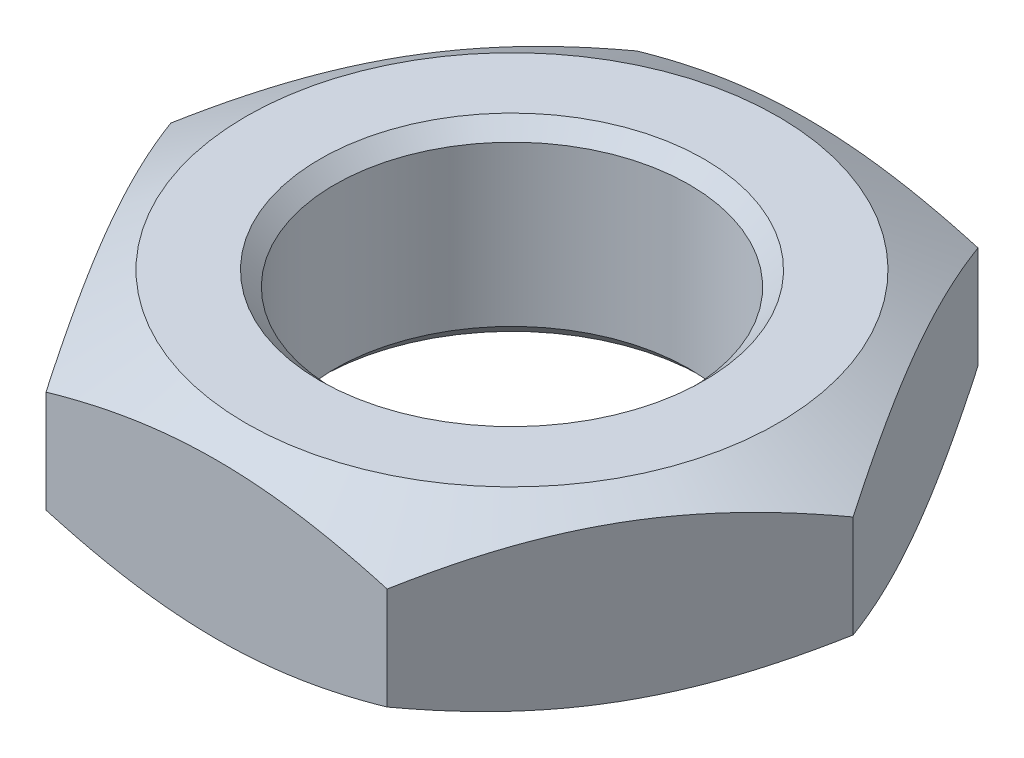
ISO-10303-21;
HEADER;
FILE_DESCRIPTION(('STEP AP214'),'2;1');
FILE_NAME('part.step','',(''),(''),'','','');
FILE_SCHEMA(('AUTOMOTIVE_DESIGN { 1 0 10303 214 1 1 1 1 }'));
ENDSEC;
DATA;
#1=APPLICATION_CONTEXT('core data for automotive mechanical design processes');
#2=APPLICATION_PROTOCOL_DEFINITION('international standard','automotive_design',2000,#1);
#3=PRODUCT_CONTEXT('',#1,'mechanical');
#4=PRODUCT('Part','Part','',(#3));
#5=PRODUCT_RELATED_PRODUCT_CATEGORY('part','',(#4));
#6=PRODUCT_DEFINITION_FORMATION('','',#4);
#7=PRODUCT_DEFINITION_CONTEXT('part definition',#1,'design');
#8=PRODUCT_DEFINITION('design','',#6,#7);
#9=PRODUCT_DEFINITION_SHAPE('','',#8);
#10=(LENGTH_UNIT() NAMED_UNIT(*) SI_UNIT(.MILLI.,.METRE.));
#11=(NAMED_UNIT(*) PLANE_ANGLE_UNIT() SI_UNIT($,.RADIAN.));
#12=(NAMED_UNIT(*) SI_UNIT($,.STERADIAN.) SOLID_ANGLE_UNIT());
#13=UNCERTAINTY_MEASURE_WITH_UNIT(LENGTH_MEASURE(1.E-05),#10,'distance_accuracy_value','');
#14=(GEOMETRIC_REPRESENTATION_CONTEXT(3) GLOBAL_UNCERTAINTY_ASSIGNED_CONTEXT((#13)) GLOBAL_UNIT_ASSIGNED_CONTEXT((#10,
#11,#12)) REPRESENTATION_CONTEXT('',''));
#15=CARTESIAN_POINT('',(0.,0.,0.));
#16=DIRECTION('',(0.,0.,1.));
#17=DIRECTION('',(1.,0.,0.));
#18=AXIS2_PLACEMENT_3D('',#15,#16,#17);
#19=CARTESIAN_POINT('',(-5.77350269189625,3.2,0.));
#20=DIRECTION('',(0.86602540378444,0.,0.499999999999998));
#21=DIRECTION('',(0.499999999999998,0.,-0.86602540378444));
#22=AXIS2_PLACEMENT_3D('',#19,#20,#21);
#23=PLANE('',#22);
#24=DIRECTION('',(0.,-1.,0.));
#25=VECTOR('',#24,1.);
#26=CARTESIAN_POINT('',(-2.88675134594813,3.2,-5.00000000000002));
#27=LINE('',#26,#25);
#28=CARTESIAN_POINT('',(-2.88675134594813,2.46474287801998,-5.00000000000002));
#29=VERTEX_POINT('',#28);
#30=CARTESIAN_POINT('',(-2.88675134594813,0.735257121980016,-5.00000000000002));
#31=VERTEX_POINT('',#30);
#32=EDGE_CURVE('E101',#29,#31,#27,.T.);
#33=ORIENTED_EDGE('',*,*,#32,.T.);
#34=CARTESIAN_POINT('',(-2.88663587589429,0.735323790646643,-5.00020000000002));
#35=CARTESIAN_POINT('',(-3.01349970319368,0.662061702232448,-4.78046540547483));
#36=CARTESIAN_POINT('',(-3.14144859993849,0.595426456512905,-4.55885141554043));
#37=CARTESIAN_POINT('',(-3.39956193532121,0.479114125605623,-4.1117860045465));
#38=CARTESIAN_POINT('',(-3.52973095989718,0.429478184510602,-3.88632664040924));
#39=CARTESIAN_POINT('',(-3.78847564779797,0.35222616001351,-3.4381676947765));
#40=CARTESIAN_POINT('',(-3.91701101576051,0.324095512878301,-3.21553790689582));
#41=CARTESIAN_POINT('',(-4.11026620624322,0.298870056548495,-2.88081009815337));
#42=CARTESIAN_POINT('',(-4.1747286887931,0.293288594364295,-2.76915780319495));
#43=CARTESIAN_POINT('',(-4.30371322717527,0.28787735134628,-2.54575002932621));
#44=CARTESIAN_POINT('',(-4.36823528110588,0.288047392853013,-2.43399455370969));
#45=CARTESIAN_POINT('',(-4.54500768479194,0.296428766386846,-2.12781576914937));
#46=CARTESIAN_POINT('',(-4.65719946015292,0.31050490649206,-1.93349391403279));
#47=CARTESIAN_POINT('',(-4.88083840557981,0.355140391704237,-1.5461398980023));
#48=CARTESIAN_POINT('',(-4.9922847895602,0.385714994742314,-1.35310909862843));
#49=CARTESIAN_POINT('',(-5.21637431361294,0.462143628215968,-0.964974657525149));
#50=CARTESIAN_POINT('',(-5.32898917185758,0.508321513473484,-0.769920001358267));
#51=CARTESIAN_POINT('',(-5.55253939626497,0.613126929086736,-0.382719654641233));
#52=CARTESIAN_POINT('',(-5.66347762579591,0.671729838032176,-0.190569004591914));
#53=CARTESIAN_POINT('',(-5.77361816195009,0.735323790646629,0.000199999999999733));
#54=B_SPLINE_CURVE_WITH_KNOTS('',3,(#34,#35,#36,#37,#38,#39,#40,#41,#42,#43,#44,#45,#46,#47,#48,
#49,#50,#51,#52,#53),.UNSPECIFIED.,.F.,.F.,(4,2,2,2,2,2,2,2,2,4),(0.,0.792555841363092,
1.58701660053334,2.36181537487281,2.74884076077326,3.13585419177295,3.8096236259968,
4.4840172390119,5.17336882348929,5.86136694793726),.UNSPECIFIED.);
#55=CARTESIAN_POINT('',(-5.77350269189625,0.735257121980003,0.));
#56=VERTEX_POINT('',#55);
#57=EDGE_CURVE('E44',#31,#56,#54,.T.);
#58=ORIENTED_EDGE('',*,*,#57,.T.);
#59=DIRECTION('',(0.,-1.,0.));
#60=VECTOR('',#59,1.);
#61=CARTESIAN_POINT('',(-5.77350269189625,3.2,0.));
#62=LINE('',#61,#60);
#63=CARTESIAN_POINT('',(-5.77350269189625,2.46474287802,0.));
#64=VERTEX_POINT('',#63);
#65=EDGE_CURVE('E114',#64,#56,#62,.T.);
#66=ORIENTED_EDGE('',*,*,#65,.F.);
#67=CARTESIAN_POINT('',(-2.88663587589429,2.46467620935336,-5.00020000000002));
#68=CARTESIAN_POINT('',(-3.01349970319368,2.53793829776755,-4.78046540547483));
#69=CARTESIAN_POINT('',(-3.14144859993849,2.6045735434871,-4.55885141554043));
#70=CARTESIAN_POINT('',(-3.39956193532121,2.72088587439438,-4.1117860045465));
#71=CARTESIAN_POINT('',(-3.52973095989718,2.7705218154894,-3.88632664040924));
#72=CARTESIAN_POINT('',(-3.78847564779797,2.84777383998649,-3.4381676947765));
#73=CARTESIAN_POINT('',(-3.91701101576051,2.8759044871217,-3.21553790689582));
#74=CARTESIAN_POINT('',(-4.11026620624322,2.90112994345151,-2.88081009815337));
#75=CARTESIAN_POINT('',(-4.1747286887931,2.90671140563571,-2.76915780319495));
#76=CARTESIAN_POINT('',(-4.30371322717527,2.91212264865372,-2.54575002932621));
#77=CARTESIAN_POINT('',(-4.36823528110588,2.91195260714699,-2.43399455370969));
#78=CARTESIAN_POINT('',(-4.54500768479194,2.90357123361316,-2.12781576914937));
#79=CARTESIAN_POINT('',(-4.65719946015292,2.88949509350794,-1.93349391403279));
#80=CARTESIAN_POINT('',(-4.88083840557981,2.84485960829576,-1.5461398980023));
#81=CARTESIAN_POINT('',(-4.9922847895602,2.81428500525769,-1.35310909862843));
#82=CARTESIAN_POINT('',(-5.21637431361294,2.73785637178403,-0.964974657525149));
#83=CARTESIAN_POINT('',(-5.32898917185758,2.69167848652652,-0.769920001358267));
#84=CARTESIAN_POINT('',(-5.55253939626497,2.58687307091326,-0.382719654641233));
#85=CARTESIAN_POINT('',(-5.66347762579591,2.52827016196783,-0.190569004591914));
#86=CARTESIAN_POINT('',(-5.77361816195009,2.46467620935337,0.00019999999999973));
#87=B_SPLINE_CURVE_WITH_KNOTS('',3,(#67,#68,#69,#70,#71,#72,#73,#74,#75,#76,#77,#78,#79,#80,#81,
#82,#83,#84,#85,#86),.UNSPECIFIED.,.F.,.F.,(4,2,2,2,2,2,2,2,2,4),(0.,0.792555841363092,
1.58701660053334,2.36181537487281,2.74884076077326,3.13585419177295,3.8096236259968,
4.4840172390119,5.17336882348929,5.86136694793726),.UNSPECIFIED.);
#88=EDGE_CURVE('E105',#29,#64,#87,.T.);
#89=ORIENTED_EDGE('',*,*,#88,.F.);
#90=EDGE_LOOP('',(#33,#58,#66,#89));
#91=FACE_BOUND('',#90,.T.);
#92=ADVANCED_FACE('F29',(#91),#23,.F.);
#93=CARTESIAN_POINT('',(-2.88675134594815,3.2,4.99999999999997));
#94=DIRECTION('',(0.86602540378444,0.,-0.499999999999998));
#95=DIRECTION('',(-0.499999999999998,0.,-0.86602540378444));
#96=AXIS2_PLACEMENT_3D('',#93,#94,#95);
#97=PLANE('',#96);
#98=ORIENTED_EDGE('',*,*,#65,.T.);
#99=CARTESIAN_POINT('',(-5.77361816195009,0.735323790646629,-0.000200000000000029));
#100=CARTESIAN_POINT('',(-5.6467543346507,0.662061702232436,0.219534594525185));
#101=CARTESIAN_POINT('',(-5.51880543790589,0.595426456512894,0.44114858445958));
#102=CARTESIAN_POINT('',(-5.26069210252317,0.479114125605615,0.888213995453513));
#103=CARTESIAN_POINT('',(-5.1305230779472,0.429478184510594,1.11367335959077));
#104=CARTESIAN_POINT('',(-4.87177839004641,0.352226160013505,1.56183230522351));
#105=CARTESIAN_POINT('',(-4.74324302208387,0.324095512878297,1.78446209310419));
#106=CARTESIAN_POINT('',(-4.54998783160116,0.298870056548493,2.11918990184664));
#107=CARTESIAN_POINT('',(-4.48552534905128,0.293288594364292,2.23084219680506));
#108=CARTESIAN_POINT('',(-4.35654081066911,0.287877351346279,2.4542499706738));
#109=CARTESIAN_POINT('',(-4.2920187567385,0.288047392853013,2.56600544629031));
#110=CARTESIAN_POINT('',(-4.11524635305245,0.296428766386846,2.87218423085063));
#111=CARTESIAN_POINT('',(-4.00305457769147,0.310504906492061,3.06650608596721));
#112=CARTESIAN_POINT('',(-3.77941563226458,0.355140391704239,3.45386010199769));
#113=CARTESIAN_POINT('',(-3.6679692482842,0.385714994742315,3.64689090137156));
#114=CARTESIAN_POINT('',(-3.44387972423145,0.462143628215968,4.03502534247483));
#115=CARTESIAN_POINT('',(-3.33126486598682,0.508321513473483,4.23007999864171));
#116=CARTESIAN_POINT('',(-3.10771464157943,0.613126929086734,4.61728034535874));
#117=CARTESIAN_POINT('',(-2.99677641204849,0.671729838032172,4.80943099540805));
#118=CARTESIAN_POINT('',(-2.88663587589432,0.735323790646624,5.00019999999996));
#119=B_SPLINE_CURVE_WITH_KNOTS('',3,(#99,#100,#101,#102,#103,#104,#105,#106,#107,#108,#109,#110,
#111,#112,#113,#114,#115,#116,#117,#118),.UNSPECIFIED.,.F.,.F.,(4,2,2,2,2,2,2,2,2,4),(0.,
0.792555841363088,1.58701660053333,2.3618153748728,2.74884076077325,3.13585419177294,
3.80962362599677,4.48401723901186,5.17336882348925,5.8613669479372),.UNSPECIFIED.);
#120=CARTESIAN_POINT('',(-2.88675134594815,0.735257121979998,4.99999999999997));
#121=VERTEX_POINT('',#120);
#122=EDGE_CURVE('E218',#56,#121,#119,.T.);
#123=ORIENTED_EDGE('',*,*,#122,.T.);
#124=DIRECTION('',(0.,-1.,0.));
#125=VECTOR('',#124,1.);
#126=CARTESIAN_POINT('',(-2.88675134594815,3.2,4.99999999999997));
#127=LINE('',#126,#125);
#128=CARTESIAN_POINT('',(-2.88675134594815,2.46474287802,4.99999999999997));
#129=VERTEX_POINT('',#128);
#130=EDGE_CURVE('E111',#129,#121,#127,.T.);
#131=ORIENTED_EDGE('',*,*,#130,.F.);
#132=CARTESIAN_POINT('',(-5.77361816195009,2.46467620935337,-0.0002));
#133=CARTESIAN_POINT('',(-5.6467543346507,2.53793829776756,0.219534594525184));
#134=CARTESIAN_POINT('',(-5.51880543790589,2.60457354348711,0.44114858445958));
#135=CARTESIAN_POINT('',(-5.26069210252317,2.72088587439439,0.888213995453513));
#136=CARTESIAN_POINT('',(-5.1305230779472,2.77052181548941,1.11367335959077));
#137=CARTESIAN_POINT('',(-4.87177839004641,2.8477738399865,1.56183230522351));
#138=CARTESIAN_POINT('',(-4.74324302208387,2.8759044871217,1.78446209310419));
#139=CARTESIAN_POINT('',(-4.54998783160116,2.90112994345151,2.11918990184664));
#140=CARTESIAN_POINT('',(-4.48552534905128,2.90671140563571,2.23084219680506));
#141=CARTESIAN_POINT('',(-4.35654081066911,2.91212264865372,2.4542499706738));
#142=CARTESIAN_POINT('',(-4.2920187567385,2.91195260714699,2.56600544629031));
#143=CARTESIAN_POINT('',(-4.11524635305245,2.90357123361315,2.87218423085063));
#144=CARTESIAN_POINT('',(-4.00305457769147,2.88949509350794,3.06650608596721));
#145=CARTESIAN_POINT('',(-3.77941563226458,2.84485960829576,3.45386010199769));
#146=CARTESIAN_POINT('',(-3.6679692482842,2.81428500525769,3.64689090137156));
#147=CARTESIAN_POINT('',(-3.44387972423145,2.73785637178403,4.03502534247483));
#148=CARTESIAN_POINT('',(-3.33126486598682,2.69167848652652,4.23007999864171));
#149=CARTESIAN_POINT('',(-3.10771464157943,2.58687307091327,4.61728034535874));
#150=CARTESIAN_POINT('',(-2.99677641204849,2.52827016196783,4.80943099540805));
#151=CARTESIAN_POINT('',(-2.88663587589432,2.46467620935338,5.00019999999996));
#152=B_SPLINE_CURVE_WITH_KNOTS('',3,(#132,#133,#134,#135,#136,#137,#138,#139,#140,#141,#142,
#143,#144,#145,#146,#147,#148,#149,#150,#151),.UNSPECIFIED.,.F.,.F.,(4,2,2,2,2,2,2,2,2,4),(0.,
0.792555841363088,1.58701660053333,2.3618153748728,2.74884076077325,3.13585419177294,
3.80962362599677,4.48401723901186,5.17336882348925,5.8613669479372),.UNSPECIFIED.);
#153=EDGE_CURVE('E160',#64,#129,#152,.T.);
#154=ORIENTED_EDGE('',*,*,#153,.F.);
#155=EDGE_LOOP('',(#98,#123,#131,#154));
#156=FACE_BOUND('',#155,.T.);
#157=ADVANCED_FACE('F150',(#156),#97,.F.);
#158=CARTESIAN_POINT('',(2.88675134594816,3.2,4.99999999999997));
#159=DIRECTION('',(0.,0.,-1.));
#160=DIRECTION('',(-1.,0.,0.));
#161=AXIS2_PLACEMENT_3D('',#158,#159,#160);
#162=PLANE('',#161);
#163=ORIENTED_EDGE('',*,*,#130,.T.);
#164=CARTESIAN_POINT('',(-7.67424266617577,2.69008668639454,4.99999999999997));
#165=CARTESIAN_POINT('',(-7.45650712496601,2.58478938651722,4.99999999999997));
#166=CARTESIAN_POINT('',(-7.23826305239856,2.48052517639314,4.99999999999997));
#167=CARTESIAN_POINT('',(-6.80048707372623,2.27464567989357,4.99999999999997));
#168=CARTESIAN_POINT('',(-6.58095496369159,2.17303082764698,4.99999999999997));
#169=CARTESIAN_POINT('',(-6.13916226954692,1.97250436282504,4.99999999999997));
#170=CARTESIAN_POINT('',(-5.91689328206098,1.87361119869213,4.99999999999997));
#171=CARTESIAN_POINT('',(-5.47055908649732,1.67998059287781,4.99999999999997));
#172=CARTESIAN_POINT('',(-5.24649396637654,1.58524294915253,4.99999999999997));
#173=CARTESIAN_POINT('',(-4.7893152686145,1.39820205975359,4.99999999999997));
#174=CARTESIAN_POINT('',(-4.55613457527415,1.30606194720281,4.99999999999997));
#175=CARTESIAN_POINT('',(-4.08701577659728,1.12895085351053,4.99999999999997));
#176=CARTESIAN_POINT('',(-3.85107736105748,1.04398068789288,4.99999999999997));
#177=CARTESIAN_POINT('',(-3.37653585976051,0.883498750965564,4.99999999999997));
#178=CARTESIAN_POINT('',(-3.13793955866337,0.807967123459956,4.99999999999997));
#179=CARTESIAN_POINT('',(-2.65732610585403,0.668838421114892,4.99999999999997));
#180=CARTESIAN_POINT('',(-2.4153100832112,0.605237501814807,4.99999999999997));
#181=CARTESIAN_POINT('',(-1.92903620795064,0.493405348623645,4.99999999999997));
#182=CARTESIAN_POINT('',(-1.68479700789419,0.445094525638156,4.99999999999997));
#183=CARTESIAN_POINT('',(-1.19336727900909,0.366632034538383,4.99999999999997));
#184=CARTESIAN_POINT('',(-0.946177008341047,0.336478789693633,4.99999999999997));
#185=CARTESIAN_POINT('',(-0.453274670503006,0.297133032670733,4.99999999999997));
#186=CARTESIAN_POINT('',(-0.20758414007709,0.287677337941843,4.99999999999997));
#187=CARTESIAN_POINT('',(0.283721907876852,0.289840272684433,4.99999999999997));
#188=CARTESIAN_POINT('',(0.529337422979503,0.30145952354635,4.99999999999997));
#189=CARTESIAN_POINT('',(0.948718465808786,0.3384819821124,4.99999999999997));
#190=CARTESIAN_POINT('',(1.12294036223796,0.358991867272684,4.99999999999997));
#191=CARTESIAN_POINT('',(1.47004823746262,0.40929449008512,4.99999999999997));
#192=CARTESIAN_POINT('',(1.64293402116819,0.439088558052839,4.99999999999997));
#193=CARTESIAN_POINT('',(2.15939010253456,0.540824520596738,4.99999999999997));
#194=CARTESIAN_POINT('',(2.50055467476973,0.625099791009425,4.99999999999997));
#195=CARTESIAN_POINT('',(3.01061797223764,0.770470270516962,4.99999999999997));
#196=CARTESIAN_POINT('',(3.18217888624518,0.822749938714918,4.99999999999997));
#197=CARTESIAN_POINT('',(3.52363280333808,0.932546178651754,4.99999999999997));
#198=CARTESIAN_POINT('',(3.69352579556189,0.990062784468678,4.99999999999997));
#199=CARTESIAN_POINT('',(4.03170180497546,1.10942599059165,4.99999999999997));
#200=CARTESIAN_POINT('',(4.19998537363545,1.17127104256856,4.99999999999997));
#201=CARTESIAN_POINT('',(4.53517101606396,1.29858282117489,4.99999999999997));
#202=CARTESIAN_POINT('',(4.70207310450403,1.36404950928505,4.99999999999997));
#203=CARTESIAN_POINT('',(5.08980602948461,1.52021305593794,4.99999999999997));
#204=CARTESIAN_POINT('',(5.31016583407146,1.61207713832132,4.99999999999997));
#205=CARTESIAN_POINT('',(5.74907731355416,1.80003892533716,4.99999999999997));
#206=CARTESIAN_POINT('',(5.96762889034246,1.89613685791614,4.99999999999997));
#207=CARTESIAN_POINT('',(6.40325065578351,2.09173054768495,4.99999999999997));
#208=CARTESIAN_POINT('',(6.62032056522339,2.19122692518072,4.99999999999997));
#209=CARTESIAN_POINT('',(7.05318748262057,2.39295504203552,4.99999999999997));
#210=CARTESIAN_POINT('',(7.26898446544068,2.49518683519305,4.99999999999997));
#211=CARTESIAN_POINT('',(7.91517585706596,2.80539138785612,4.99999999999997));
#212=CARTESIAN_POINT('',(8.34397184898757,3.0166918454417,4.99999999999997));
#213=CARTESIAN_POINT('',(9.19853243826548,3.44533535925732,4.99999999999997));
#214=CARTESIAN_POINT('',(9.62429693074941,3.66267862327008,4.99999999999997));
#215=CARTESIAN_POINT('',(10.2440049625286,3.98301188380493,4.99999999999997));
#216=CARTESIAN_POINT('',(10.4388319162336,4.08429775545548,4.99999999999997));
#217=CARTESIAN_POINT('',(10.8280674822379,4.28766207109142,4.99999999999997));
#218=CARTESIAN_POINT('',(11.0224761017187,4.3897405013304,4.99999999999997));
#219=CARTESIAN_POINT('',(11.6051739882778,4.69701353472328,4.99999999999997));
#220=CARTESIAN_POINT('',(11.9929201954311,4.90323806002205,4.99999999999997));
#221=CARTESIAN_POINT('',(12.7663903289205,5.3173045554409,4.99999999999997));
#222=CARTESIAN_POINT('',(13.1521168593334,5.52514167010266,4.99999999999997));
#223=CARTESIAN_POINT('',(13.9226495235106,5.94246873395886,4.99999999999997));
#224=CARTESIAN_POINT('',(14.3074557035392,6.15195859769582,4.99999999999997));
#225=CARTESIAN_POINT('',(14.6919212381337,6.36206794052873,4.99999999999997));
#226=B_SPLINE_CURVE_WITH_KNOTS('',3,(#164,#165,#166,#167,#168,#169,#170,#171,#172,#173,#174,
#175,#176,#177,#178,#179,#180,#181,#182,#183,#184,#185,#186,#187,#188,#189,#190,#191,#192,#193,
#194,#195,#196,#197,#198,#199,#200,#201,#202,#203,#204,#205,#206,#207,#208,#209,#210,#211,#212,
#213,#214,#215,#216,#217,#218,#219,#220,#221,#222,#223,#224,#225),.UNSPECIFIED.,.F.,.F.,(4,2,2,
2,2,2,2,2,2,2,2,2,2,2,2,2,2,2,2,2,2,2,2,2,2,2,2,2,2,2,4),(0.,0.725589440089206,1.45129703878732,
2.18109194188299,2.91085132249774,3.66293531191326,4.4151047298541,5.16566414452625,
5.9159812876234,6.66232602268379,7.40860593884413,8.14533992312202,8.88209563020306,
9.40811386672321,9.93420751023272,10.9870084296607,11.525014510236,12.0630240919997,
12.6008421963042,13.1386545815425,13.8548196848868,14.5710233931173,15.2873585334526,
16.0037077726086,17.4377205700833,18.8717827374133,19.5305280324017,20.1892619272938,
21.5067806989771,22.8212464086716,24.1356445919713),.UNSPECIFIED.);
#227=CARTESIAN_POINT('',(2.88675134594816,0.735257121979998,4.99999999999997));
#228=VERTEX_POINT('',#227);
#229=EDGE_CURVE('E211',#121,#228,#226,.T.);
#230=ORIENTED_EDGE('',*,*,#229,.T.);
#231=DIRECTION('',(0.,-1.,0.));
#232=VECTOR('',#231,1.);
#233=CARTESIAN_POINT('',(2.88675134594816,3.2,4.99999999999997));
#234=LINE('',#233,#232);
#235=CARTESIAN_POINT('',(2.88675134594816,2.46474287802,4.99999999999997));
#236=VERTEX_POINT('',#235);
#237=EDGE_CURVE('E103',#236,#228,#234,.T.);
#238=ORIENTED_EDGE('',*,*,#237,.F.);
#239=CARTESIAN_POINT('',(-7.67424266617577,0.509913313605458,4.99999999999997));
#240=CARTESIAN_POINT('',(-7.45650712496601,0.615210613482781,4.99999999999997));
#241=CARTESIAN_POINT('',(-7.23826305239856,0.719474823606856,4.99999999999997));
#242=CARTESIAN_POINT('',(-6.80048707372623,0.925354320106427,4.99999999999997));
#243=CARTESIAN_POINT('',(-6.58095496369159,1.02696917235302,4.99999999999997));
#244=CARTESIAN_POINT('',(-6.13916226954692,1.22749563717496,4.99999999999997));
#245=CARTESIAN_POINT('',(-5.91689328206098,1.32638880130787,4.99999999999997));
#246=CARTESIAN_POINT('',(-5.47055908649732,1.5200194071222,4.99999999999997));
#247=CARTESIAN_POINT('',(-5.24649396637654,1.61475705084747,4.99999999999997));
#248=CARTESIAN_POINT('',(-4.78931526861449,1.80179794024641,4.99999999999997));
#249=CARTESIAN_POINT('',(-4.55613457527415,1.89393805279719,4.99999999999997));
#250=CARTESIAN_POINT('',(-4.08701577659728,2.07104914648947,4.99999999999997));
#251=CARTESIAN_POINT('',(-3.85107736105748,2.15601931210712,4.99999999999997));
#252=CARTESIAN_POINT('',(-3.37653585976051,2.31650124903444,4.99999999999997));
#253=CARTESIAN_POINT('',(-3.13793955866337,2.39203287654004,4.99999999999997));
#254=CARTESIAN_POINT('',(-2.65732610585403,2.53116157888511,4.99999999999997));
#255=CARTESIAN_POINT('',(-2.4153100832112,2.59476249818519,4.99999999999997));
#256=CARTESIAN_POINT('',(-1.92903620795064,2.70659465137636,4.99999999999997));
#257=CARTESIAN_POINT('',(-1.68479700789419,2.75490547436184,4.99999999999997));
#258=CARTESIAN_POINT('',(-1.19336727900909,2.83336796546162,4.99999999999997));
#259=CARTESIAN_POINT('',(-0.946177008341047,2.86352121030637,4.99999999999997));
#260=CARTESIAN_POINT('',(-0.453274670503006,2.90286696732927,4.99999999999997));
#261=CARTESIAN_POINT('',(-0.207584140077091,2.91232266205816,4.99999999999997));
#262=CARTESIAN_POINT('',(0.283721907876851,2.91015972731557,4.99999999999997));
#263=CARTESIAN_POINT('',(0.529337422979502,2.89854047645365,4.99999999999997));
#264=CARTESIAN_POINT('',(0.948718465808785,2.8615180178876,4.99999999999997));
#265=CARTESIAN_POINT('',(1.12294036223796,2.84100813272732,4.99999999999997));
#266=CARTESIAN_POINT('',(1.47004823746262,2.79070550991488,4.99999999999997));
#267=CARTESIAN_POINT('',(1.64293402116819,2.76091144194716,4.99999999999997));
#268=CARTESIAN_POINT('',(2.15939010253456,2.65917547940326,4.99999999999997));
#269=CARTESIAN_POINT('',(2.50055467476973,2.57490020899058,4.99999999999997));
#270=CARTESIAN_POINT('',(3.01061797223764,2.42952972948304,4.99999999999997));
#271=CARTESIAN_POINT('',(3.18217888624518,2.37725006128508,4.99999999999997));
#272=CARTESIAN_POINT('',(3.52363280333808,2.26745382134825,4.99999999999997));
#273=CARTESIAN_POINT('',(3.69352579556189,2.20993721553132,4.99999999999997));
#274=CARTESIAN_POINT('',(4.03170180497546,2.09057400940835,4.99999999999997));
#275=CARTESIAN_POINT('',(4.19998537363545,2.02872895743144,4.99999999999997));
#276=CARTESIAN_POINT('',(4.53517101606396,1.90141717882511,4.99999999999997));
#277=CARTESIAN_POINT('',(4.70207310450403,1.83595049071496,4.99999999999997));
#278=CARTESIAN_POINT('',(5.08980602948461,1.67978694406206,4.99999999999997));
#279=CARTESIAN_POINT('',(5.31016583407146,1.58792286167868,4.99999999999997));
#280=CARTESIAN_POINT('',(5.74907731355416,1.39996107466284,4.99999999999997));
#281=CARTESIAN_POINT('',(5.96762889034246,1.30386314208386,4.99999999999997));
#282=CARTESIAN_POINT('',(6.40325065578351,1.10826945231505,4.99999999999997));
#283=CARTESIAN_POINT('',(6.62032056522339,1.00877307481928,4.99999999999997));
#284=CARTESIAN_POINT('',(7.05318748262056,0.807044957964483,4.99999999999997));
#285=CARTESIAN_POINT('',(7.26898446544068,0.704813164806949,4.99999999999997));
#286=CARTESIAN_POINT('',(7.91517585706596,0.394608612143876,4.99999999999997));
#287=CARTESIAN_POINT('',(8.34397184898757,0.183308154558296,4.99999999999997));
#288=CARTESIAN_POINT('',(9.19853243826548,-0.245335359257321,4.99999999999997));
#289=CARTESIAN_POINT('',(9.62429693074941,-0.462678623270074,4.99999999999997));
#290=CARTESIAN_POINT('',(10.2440049625286,-0.783011883804932,4.99999999999997));
#291=CARTESIAN_POINT('',(10.4388319162336,-0.884297755455483,4.99999999999997));
#292=CARTESIAN_POINT('',(10.8280674822379,-1.08766207109142,4.99999999999997));
#293=CARTESIAN_POINT('',(11.0224761017187,-1.1897405013304,4.99999999999997));
#294=CARTESIAN_POINT('',(11.6051739882778,-1.49701353472328,4.99999999999997));
#295=CARTESIAN_POINT('',(11.9929201954311,-1.70323806002205,4.99999999999997));
#296=CARTESIAN_POINT('',(12.7663903289205,-2.1173045554409,4.99999999999997));
#297=CARTESIAN_POINT('',(13.1521168593334,-2.32514167010266,4.99999999999997));
#298=CARTESIAN_POINT('',(13.9226495235106,-2.74246873395886,4.99999999999997));
#299=CARTESIAN_POINT('',(14.3074557035392,-2.95195859769582,4.99999999999997));
#300=CARTESIAN_POINT('',(14.6919212381337,-3.16206794052873,4.99999999999997));
#301=B_SPLINE_CURVE_WITH_KNOTS('',3,(#239,#240,#241,#242,#243,#244,#245,#246,#247,#248,#249,
#250,#251,#252,#253,#254,#255,#256,#257,#258,#259,#260,#261,#262,#263,#264,#265,#266,#267,#268,
#269,#270,#271,#272,#273,#274,#275,#276,#277,#278,#279,#280,#281,#282,#283,#284,#285,#286,#287,
#288,#289,#290,#291,#292,#293,#294,#295,#296,#297,#298,#299,#300),.UNSPECIFIED.,.F.,.F.,(4,2,2,
2,2,2,2,2,2,2,2,2,2,2,2,2,2,2,2,2,2,2,2,2,2,2,2,2,2,2,4),(0.,0.725589440089206,1.45129703878732,
2.18109194188299,2.91085132249774,3.66293531191327,4.4151047298541,5.16566414452625,
5.9159812876234,6.66232602268379,7.40860593884413,8.14533992312202,8.88209563020306,
9.40811386672321,9.93420751023272,10.9870084296607,11.525014510236,12.0630240919997,
12.6008421963042,13.1386545815425,13.8548196848868,14.5710233931173,15.2873585334526,
16.0037077726086,17.4377205700833,18.8717827374132,19.5305280324017,20.1892619272938,
21.5067806989771,22.8212464086716,24.1356445919713),.UNSPECIFIED.);
#302=EDGE_CURVE('E161',#129,#236,#301,.T.);
#303=ORIENTED_EDGE('',*,*,#302,.F.);
#304=EDGE_LOOP('',(#163,#230,#238,#303));
#305=FACE_BOUND('',#304,.T.);
#306=ADVANCED_FACE('F155',(#305),#162,.F.);
#307=CARTESIAN_POINT('',(5.77350269189625,3.2,0.));
#308=DIRECTION('',(-0.86602540378444,0.,-0.499999999999998));
#309=DIRECTION('',(-0.499999999999998,0.,0.86602540378444));
#310=AXIS2_PLACEMENT_3D('',#307,#308,#309);
#311=PLANE('',#310);
#312=ORIENTED_EDGE('',*,*,#237,.T.);
#313=CARTESIAN_POINT('',(2.88663587589432,0.735323790646625,5.00019999999996));
#314=CARTESIAN_POINT('',(3.01349970319371,0.662061702232432,4.78046540547478));
#315=CARTESIAN_POINT('',(3.14144859993852,0.595426456512891,4.55885141554038));
#316=CARTESIAN_POINT('',(3.39956193532123,0.479114125605612,4.11178600454645));
#317=CARTESIAN_POINT('',(3.5297309598972,0.429478184510592,3.88632664040919));
#318=CARTESIAN_POINT('',(3.788475647798,0.352226160013503,3.43816769477646));
#319=CARTESIAN_POINT('',(3.91701101576054,0.324095512878296,3.21553790689577));
#320=CARTESIAN_POINT('',(4.11026620624324,0.298870056548492,2.88081009815333));
#321=CARTESIAN_POINT('',(4.17472868879313,0.293288594364292,2.76915780319491));
#322=CARTESIAN_POINT('',(4.30371322717529,0.28787735134628,2.54575002932617));
#323=CARTESIAN_POINT('',(4.36823528110591,0.288047392853013,2.43399455370966));
#324=CARTESIAN_POINT('',(4.54500768479196,0.296428766386847,2.12781576914933));
#325=CARTESIAN_POINT('',(4.65719946015294,0.310504906492062,1.93349391403276));
#326=CARTESIAN_POINT('',(4.88083840557982,0.355140391704241,1.54613989800227));
#327=CARTESIAN_POINT('',(4.99228478956021,0.385714994742318,1.35310909862841));
#328=CARTESIAN_POINT('',(5.21637431361295,0.462143628215972,0.964974657525132));
#329=CARTESIAN_POINT('',(5.32898917185759,0.508321513473487,0.769920001358253));
#330=CARTESIAN_POINT('',(5.55253939626498,0.613126929086738,0.382719654641226));
#331=CARTESIAN_POINT('',(5.66347762579591,0.671729838032176,0.19056900459191));
#332=CARTESIAN_POINT('',(5.77361816195009,0.735323790646628,-0.000199999999999926));
#333=B_SPLINE_CURVE_WITH_KNOTS('',3,(#313,#314,#315,#316,#317,#318,#319,#320,#321,#322,#323,
#324,#325,#326,#327,#328,#329,#330,#331,#332),.UNSPECIFIED.,.F.,.F.,(4,2,2,2,2,2,2,2,2,4),(0.,
0.792555841363088,1.58701660053333,2.3618153748728,2.74884076077324,3.13585419177294,
3.80962362599677,4.48401723901186,5.17336882348925,5.8613669479372),.UNSPECIFIED.);
#334=CARTESIAN_POINT('',(5.77350269189625,0.735257121980002,0.));
#335=VERTEX_POINT('',#334);
#336=EDGE_CURVE('E97',#228,#335,#333,.T.);
#337=ORIENTED_EDGE('',*,*,#336,.T.);
#338=DIRECTION('',(0.,-1.,0.));
#339=VECTOR('',#338,1.);
#340=CARTESIAN_POINT('',(5.77350269189625,3.2,0.));
#341=LINE('',#340,#339);
#342=CARTESIAN_POINT('',(5.77350269189625,2.46474287802,0.));
#343=VERTEX_POINT('',#342);
#344=EDGE_CURVE('E96',#343,#335,#341,.T.);
#345=ORIENTED_EDGE('',*,*,#344,.F.);
#346=CARTESIAN_POINT('',(2.88663587589432,2.46467620935338,5.00019999999996));
#347=CARTESIAN_POINT('',(3.01349970319371,2.53793829776757,4.78046540547478));
#348=CARTESIAN_POINT('',(3.14144859993852,2.60457354348711,4.55885141554038));
#349=CARTESIAN_POINT('',(3.39956193532123,2.72088587439439,4.11178600454645));
#350=CARTESIAN_POINT('',(3.5297309598972,2.77052181548941,3.88632664040919));
#351=CARTESIAN_POINT('',(3.788475647798,2.8477738399865,3.43816769477646));
#352=CARTESIAN_POINT('',(3.91701101576054,2.87590448712171,3.21553790689577));
#353=CARTESIAN_POINT('',(4.11026620624324,2.90112994345151,2.88081009815333));
#354=CARTESIAN_POINT('',(4.17472868879313,2.90671140563571,2.76915780319491));
#355=CARTESIAN_POINT('',(4.30371322717529,2.91212264865372,2.54575002932617));
#356=CARTESIAN_POINT('',(4.36823528110591,2.91195260714699,2.43399455370966));
#357=CARTESIAN_POINT('',(4.54500768479196,2.90357123361315,2.12781576914933));
#358=CARTESIAN_POINT('',(4.65719946015294,2.88949509350794,1.93349391403276));
#359=CARTESIAN_POINT('',(4.88083840557982,2.84485960829576,1.54613989800227));
#360=CARTESIAN_POINT('',(4.99228478956021,2.81428500525768,1.35310909862841));
#361=CARTESIAN_POINT('',(5.21637431361295,2.73785637178403,0.964974657525132));
#362=CARTESIAN_POINT('',(5.32898917185759,2.69167848652651,0.769920001358253));
#363=CARTESIAN_POINT('',(5.55253939626498,2.58687307091326,0.382719654641226));
#364=CARTESIAN_POINT('',(5.66347762579591,2.52827016196782,0.19056900459191));
#365=CARTESIAN_POINT('',(5.77361816195009,2.46467620935337,-0.000199999999999913));
#366=B_SPLINE_CURVE_WITH_KNOTS('',3,(#346,#347,#348,#349,#350,#351,#352,#353,#354,#355,#356,
#357,#358,#359,#360,#361,#362,#363,#364,#365),.UNSPECIFIED.,.F.,.F.,(4,2,2,2,2,2,2,2,2,4),(0.,
0.792555841363088,1.58701660053333,2.3618153748728,2.74884076077324,3.13585419177294,
3.80962362599677,4.48401723901186,5.17336882348925,5.8613669479372),.UNSPECIFIED.);
#367=EDGE_CURVE('E194',#236,#343,#366,.T.);
#368=ORIENTED_EDGE('',*,*,#367,.F.);
#369=EDGE_LOOP('',(#312,#337,#345,#368));
#370=FACE_BOUND('',#369,.T.);
#371=ADVANCED_FACE('F205',(#370),#311,.F.);
#372=CARTESIAN_POINT('',(2.88675134594813,3.2,-5.00000000000002));
#373=DIRECTION('',(-0.86602540378444,0.,0.499999999999998));
#374=DIRECTION('',(0.499999999999998,0.,0.86602540378444));
#375=AXIS2_PLACEMENT_3D('',#372,#373,#374);
#376=PLANE('',#375);
#377=ORIENTED_EDGE('',*,*,#344,.T.);
#378=CARTESIAN_POINT('',(5.77361816195009,0.735323790646629,0.0002));
#379=CARTESIAN_POINT('',(5.6467543346507,0.662061702232436,-0.219534594525186));
#380=CARTESIAN_POINT('',(5.51880543790589,0.595426456512894,-0.441148584459581));
#381=CARTESIAN_POINT('',(5.26069210252317,0.479114125605615,-0.888213995453513));
#382=CARTESIAN_POINT('',(5.1305230779472,0.429478184510594,-1.11367335959077));
#383=CARTESIAN_POINT('',(4.87177839004641,0.352226160013504,-1.56183230522351));
#384=CARTESIAN_POINT('',(4.74324302208387,0.324095512878297,-1.78446209310419));
#385=CARTESIAN_POINT('',(4.54998783160116,0.298870056548492,-2.11918990184664));
#386=CARTESIAN_POINT('',(4.48552534905128,0.293288594364292,-2.23084219680506));
#387=CARTESIAN_POINT('',(4.35654081066911,0.287877351346279,-2.4542499706738));
#388=CARTESIAN_POINT('',(4.2920187567385,0.288047392853013,-2.56600544629031));
#389=CARTESIAN_POINT('',(4.11524635305244,0.296428766386847,-2.87218423085064));
#390=CARTESIAN_POINT('',(4.00305457769146,0.310504906492062,-3.06650608596722));
#391=CARTESIAN_POINT('',(3.77941563226457,0.355140391704241,-3.45386010199771));
#392=CARTESIAN_POINT('',(3.66796924828418,0.385714994742319,-3.64689090137158));
#393=CARTESIAN_POINT('',(3.44387972423144,0.462143628215975,-4.03502534247486));
#394=CARTESIAN_POINT('',(3.3312648659868,0.508321513473492,-4.23007999864175));
#395=CARTESIAN_POINT('',(3.1077146415794,0.613126929086746,-4.61728034535878));
#396=CARTESIAN_POINT('',(2.99677641204847,0.671729838032187,-4.8094309954081));
#397=CARTESIAN_POINT('',(2.88663587589429,0.735323790646641,-5.00020000000002));
#398=B_SPLINE_CURVE_WITH_KNOTS('',3,(#378,#379,#380,#381,#382,#383,#384,#385,#386,#387,#388,
#389,#390,#391,#392,#393,#394,#395,#396,#397),.UNSPECIFIED.,.F.,.F.,(4,2,2,2,2,2,2,2,2,4),(0.,
0.792555841363089,1.58701660053333,2.3618153748728,2.74884076077325,3.13585419177294,
3.80962362599679,4.48401723901189,5.17336882348929,5.86136694793726),.UNSPECIFIED.);
#399=CARTESIAN_POINT('',(2.88675134594813,0.735257121980015,-5.00000000000002));
#400=VERTEX_POINT('',#399);
#401=EDGE_CURVE('E82',#335,#400,#398,.T.);
#402=ORIENTED_EDGE('',*,*,#401,.T.);
#403=DIRECTION('',(0.,-1.,0.));
#404=VECTOR('',#403,1.);
#405=CARTESIAN_POINT('',(2.88675134594813,3.2,-5.00000000000002));
#406=LINE('',#405,#404);
#407=CARTESIAN_POINT('',(2.88675134594813,2.46474287801999,-5.00000000000002));
#408=VERTEX_POINT('',#407);
#409=EDGE_CURVE('E94',#408,#400,#406,.T.);
#410=ORIENTED_EDGE('',*,*,#409,.F.);
#411=CARTESIAN_POINT('',(5.77361816195009,2.46467620935337,0.000199999999999964));
#412=CARTESIAN_POINT('',(5.6467543346507,2.53793829776756,-0.219534594525185));
#413=CARTESIAN_POINT('',(5.51880543790589,2.60457354348711,-0.44114858445958));
#414=CARTESIAN_POINT('',(5.26069210252317,2.72088587439439,-0.888213995453512));
#415=CARTESIAN_POINT('',(5.1305230779472,2.77052181548941,-1.11367335959077));
#416=CARTESIAN_POINT('',(4.87177839004641,2.8477738399865,-1.56183230522351));
#417=CARTESIAN_POINT('',(4.74324302208387,2.8759044871217,-1.78446209310419));
#418=CARTESIAN_POINT('',(4.54998783160116,2.90112994345151,-2.11918990184664));
#419=CARTESIAN_POINT('',(4.48552534905128,2.90671140563571,-2.23084219680506));
#420=CARTESIAN_POINT('',(4.35654081066911,2.91212264865372,-2.4542499706738));
#421=CARTESIAN_POINT('',(4.2920187567385,2.91195260714699,-2.56600544629031));
#422=CARTESIAN_POINT('',(4.11524635305244,2.90357123361315,-2.87218423085064));
#423=CARTESIAN_POINT('',(4.00305457769146,2.88949509350794,-3.06650608596721));
#424=CARTESIAN_POINT('',(3.77941563226457,2.84485960829576,-3.45386010199771));
#425=CARTESIAN_POINT('',(3.66796924828418,2.81428500525768,-3.64689090137158));
#426=CARTESIAN_POINT('',(3.44387972423144,2.73785637178403,-4.03502534247486));
#427=CARTESIAN_POINT('',(3.3312648659868,2.69167848652651,-4.23007999864175));
#428=CARTESIAN_POINT('',(3.1077146415794,2.58687307091326,-4.61728034535878));
#429=CARTESIAN_POINT('',(2.99677641204847,2.52827016196781,-4.8094309954081));
#430=CARTESIAN_POINT('',(2.88663587589429,2.46467620935336,-5.00020000000002));
#431=B_SPLINE_CURVE_WITH_KNOTS('',3,(#411,#412,#413,#414,#415,#416,#417,#418,#419,#420,#421,
#422,#423,#424,#425,#426,#427,#428,#429,#430),.UNSPECIFIED.,.F.,.F.,(4,2,2,2,2,2,2,2,2,4),(0.,
0.792555841363088,1.58701660053333,2.3618153748728,2.74884076077325,3.13585419177294,
3.80962362599679,4.48401723901189,5.17336882348929,5.86136694793726),.UNSPECIFIED.);
#432=EDGE_CURVE('E52',#343,#408,#431,.T.);
#433=ORIENTED_EDGE('',*,*,#432,.F.);
#434=EDGE_LOOP('',(#377,#402,#410,#433));
#435=FACE_BOUND('',#434,.T.);
#436=ADVANCED_FACE('F93',(#435),#376,.F.);
#437=CARTESIAN_POINT('',(-2.88675134594813,3.2,-5.00000000000002));
#438=DIRECTION('',(0.,0.,1.));
#439=DIRECTION('',(1.,0.,0.));
#440=AXIS2_PLACEMENT_3D('',#437,#438,#439);
#441=PLANE('',#440);
#442=ORIENTED_EDGE('',*,*,#409,.T.);
#443=CARTESIAN_POINT('',(-7.67424266617579,2.69008668639457,-5.00000000000002));
#444=CARTESIAN_POINT('',(-7.45650712496602,2.58478938651724,-5.00000000000002));
#445=CARTESIAN_POINT('',(-7.23826305239858,2.48052517639317,-5.00000000000002));
#446=CARTESIAN_POINT('',(-6.80048707372624,2.27464567989359,-5.00000000000002));
#447=CARTESIAN_POINT('',(-6.5809549636916,2.173030827647,-5.00000000000002));
#448=CARTESIAN_POINT('',(-6.13916226954693,1.97250436282506,-5.00000000000002));
#449=CARTESIAN_POINT('',(-5.91689328206099,1.87361119869215,-5.00000000000002));
#450=CARTESIAN_POINT('',(-5.47055908649733,1.67998059287783,-5.00000000000002));
#451=CARTESIAN_POINT('',(-5.24649396637654,1.58524294915255,-5.00000000000002));
#452=CARTESIAN_POINT('',(-4.78931526861449,1.39820205975361,-5.00000000000002));
#453=CARTESIAN_POINT('',(-4.55613457527414,1.30606194720283,-5.00000000000002));
#454=CARTESIAN_POINT('',(-4.08701577659727,1.12895085351055,-5.00000000000002));
#455=CARTESIAN_POINT('',(-3.85107736105747,1.0439806878929,-5.00000000000002));
#456=CARTESIAN_POINT('',(-3.37653585976049,0.883498750965584,-5.00000000000002));
#457=CARTESIAN_POINT('',(-3.13793955866336,0.807967123459976,-5.00000000000002));
#458=CARTESIAN_POINT('',(-2.65732610585401,0.668838421114913,-5.00000000000002));
#459=CARTESIAN_POINT('',(-2.41531008321118,0.605237501814828,-5.00000000000002));
#460=CARTESIAN_POINT('',(-1.92903620795061,0.493405348623667,-5.00000000000002));
#461=CARTESIAN_POINT('',(-1.68479700789416,0.445094525638179,-5.00000000000002));
#462=CARTESIAN_POINT('',(-1.19336727900906,0.366632034538408,-5.00000000000002));
#463=CARTESIAN_POINT('',(-0.946177008341013,0.336478789693658,-5.00000000000002));
#464=CARTESIAN_POINT('',(-0.45327467050297,0.297133032670761,-5.00000000000002));
#465=CARTESIAN_POINT('',(-0.207584140077053,0.287677337941872,-5.00000000000002));
#466=CARTESIAN_POINT('',(0.283721907876891,0.289840272684464,-5.00000000000002));
#467=CARTESIAN_POINT('',(0.529337422979544,0.301459523546382,-5.00000000000002));
#468=CARTESIAN_POINT('',(0.948718465808832,0.338481982112434,-5.00000000000002));
#469=CARTESIAN_POINT('',(1.12294036223801,0.358991867272719,-5.00000000000002));
#470=CARTESIAN_POINT('',(1.47004823746268,0.409294490085157,-5.00000000000002));
#471=CARTESIAN_POINT('',(1.64293402116825,0.439088558052877,-5.00000000000002));
#472=CARTESIAN_POINT('',(2.15939010253462,0.54082452059678,-5.00000000000002));
#473=CARTESIAN_POINT('',(2.5005546747698,0.62509979100947,-5.00000000000002));
#474=CARTESIAN_POINT('',(3.01061797223772,0.770470270517012,-5.00000000000002));
#475=CARTESIAN_POINT('',(3.18217888624527,0.822749938714969,-5.00000000000002));
#476=CARTESIAN_POINT('',(3.52363280333817,0.932546178651808,-5.00000000000002));
#477=CARTESIAN_POINT('',(3.69352579556199,0.990062784468734,-5.00000000000002));
#478=CARTESIAN_POINT('',(4.03170180497556,1.10942599059171,-5.00000000000002));
#479=CARTESIAN_POINT('',(4.19998537363556,1.17127104256862,-5.00000000000002));
#480=CARTESIAN_POINT('',(4.53517101606407,1.29858282117495,-5.00000000000002));
#481=CARTESIAN_POINT('',(4.70207310450414,1.36404950928511,-5.00000000000002));
#482=CARTESIAN_POINT('',(5.08980602948472,1.520213055938,-5.00000000000002));
#483=CARTESIAN_POINT('',(5.31016583407157,1.61207713832138,-5.00000000000002));
#484=CARTESIAN_POINT('',(5.74907731355426,1.80003892533723,-5.00000000000002));
#485=CARTESIAN_POINT('',(5.96762889034256,1.8961368579162,-5.00000000000002));
#486=CARTESIAN_POINT('',(6.40325065578361,2.09173054768501,-5.00000000000002));
#487=CARTESIAN_POINT('',(6.62032056522349,2.19122692518078,-5.00000000000002));
#488=CARTESIAN_POINT('',(7.05318748262065,2.39295504203558,-5.00000000000002));
#489=CARTESIAN_POINT('',(7.26898446544076,2.49518683519311,-5.00000000000002));
#490=CARTESIAN_POINT('',(7.91517585706604,2.80539138785618,-5.00000000000002));
#491=CARTESIAN_POINT('',(8.34397184898764,3.01669184544176,-5.00000000000002));
#492=CARTESIAN_POINT('',(9.19853243826555,3.44533535925737,-5.00000000000002));
#493=CARTESIAN_POINT('',(9.62429693074948,3.66267862327012,-5.00000000000002));
#494=CARTESIAN_POINT('',(10.2440049625286,3.98301188380498,-5.00000000000002));
#495=CARTESIAN_POINT('',(10.4388319162336,4.08429775545553,-5.00000000000002));
#496=CARTESIAN_POINT('',(10.828067482238,4.28766207109146,-5.00000000000002));
#497=CARTESIAN_POINT('',(11.0224761017187,4.38974050133044,-5.00000000000002));
#498=CARTESIAN_POINT('',(11.6051739882779,4.69701353472332,-5.00000000000002));
#499=CARTESIAN_POINT('',(11.9929201954311,4.90323806002209,-5.00000000000002));
#500=CARTESIAN_POINT('',(12.7663903289205,5.31730455544093,-5.00000000000002));
#501=CARTESIAN_POINT('',(13.1521168593335,5.52514167010269,-5.00000000000002));
#502=CARTESIAN_POINT('',(13.9226495235106,5.94246873395889,-5.00000000000002));
#503=CARTESIAN_POINT('',(14.3074557035392,6.15195859769584,-5.00000000000002));
#504=CARTESIAN_POINT('',(14.6919212381337,6.36206794052875,-5.00000000000002));
#505=B_SPLINE_CURVE_WITH_KNOTS('',3,(#443,#444,#445,#446,#447,#448,#449,#450,#451,#452,#453,
#454,#455,#456,#457,#458,#459,#460,#461,#462,#463,#464,#465,#466,#467,#468,#469,#470,#471,#472,
#473,#474,#475,#476,#477,#478,#479,#480,#481,#482,#483,#484,#485,#486,#487,#488,#489,#490,#491,
#492,#493,#494,#495,#496,#497,#498,#499,#500,#501,#502,#503,#504),.UNSPECIFIED.,.F.,.F.,(4,2,2,
2,2,2,2,2,2,2,2,2,2,2,2,2,2,2,2,2,2,2,2,2,2,2,2,2,2,2,4),(0.,0.725589440089209,1.45129703878733,
2.18109194188301,2.91085132249776,3.66293531191329,4.41510472985413,5.16566414452628,
5.91598128762344,6.66232602268383,7.40860593884418,8.14533992312208,8.88209563020312,
9.40811386672328,9.9342075102328,10.9870084296608,11.5250145102361,12.0630240919998,
12.6008421963043,13.1386545815426,13.8548196848869,14.5710233931174,15.2873585334527,
16.0037077726087,17.4377205700834,18.8717827374133,19.5305280324017,20.1892619272939,
21.5067806989772,22.8212464086717,24.1356445919713),.UNSPECIFIED.);
#506=EDGE_CURVE('E79',#400,#31,#505,.F.);
#507=ORIENTED_EDGE('',*,*,#506,.T.);
#508=ORIENTED_EDGE('',*,*,#32,.F.);
#509=CARTESIAN_POINT('',(-7.67424266617579,0.509913313605433,-5.00000000000002));
#510=CARTESIAN_POINT('',(-7.45650712496603,0.615210613482757,-5.00000000000002));
#511=CARTESIAN_POINT('',(-7.23826305239858,0.719474823606833,-5.00000000000002));
#512=CARTESIAN_POINT('',(-6.80048707372624,0.925354320106405,-5.00000000000002));
#513=CARTESIAN_POINT('',(-6.5809549636916,1.026969172353,-5.00000000000002));
#514=CARTESIAN_POINT('',(-6.13916226954692,1.22749563717494,-5.00000000000002));
#515=CARTESIAN_POINT('',(-5.91689328206099,1.32638880130785,-5.00000000000002));
#516=CARTESIAN_POINT('',(-5.47055908649733,1.52001940712217,-5.00000000000002));
#517=CARTESIAN_POINT('',(-5.24649396637654,1.61475705084745,-5.00000000000002));
#518=CARTESIAN_POINT('',(-4.78931526861449,1.80179794024639,-5.00000000000002));
#519=CARTESIAN_POINT('',(-4.55613457527415,1.89393805279717,-5.00000000000002));
#520=CARTESIAN_POINT('',(-4.08701577659727,2.07104914648945,-5.00000000000002));
#521=CARTESIAN_POINT('',(-3.85107736105747,2.1560193121071,-5.00000000000002));
#522=CARTESIAN_POINT('',(-3.3765358597605,2.31650124903442,-5.00000000000002));
#523=CARTESIAN_POINT('',(-3.13793955866336,2.39203287654002,-5.00000000000002));
#524=CARTESIAN_POINT('',(-2.65732610585401,2.53116157888509,-5.00000000000002));
#525=CARTESIAN_POINT('',(-2.41531008321118,2.59476249818517,-5.00000000000002));
#526=CARTESIAN_POINT('',(-1.92903620795061,2.70659465137633,-5.00000000000002));
#527=CARTESIAN_POINT('',(-1.68479700789416,2.75490547436182,-5.00000000000002));
#528=CARTESIAN_POINT('',(-1.19336727900906,2.83336796546159,-5.00000000000002));
#529=CARTESIAN_POINT('',(-0.946177008341014,2.86352121030634,-5.00000000000002));
#530=CARTESIAN_POINT('',(-0.45327467050297,2.90286696732924,-5.00000000000002));
#531=CARTESIAN_POINT('',(-0.207584140077053,2.91232266205813,-5.00000000000002));
#532=CARTESIAN_POINT('',(0.283721907876892,2.91015972731554,-5.00000000000002));
#533=CARTESIAN_POINT('',(0.529337422979545,2.89854047645362,-5.00000000000002));
#534=CARTESIAN_POINT('',(0.948718465808832,2.86151801788757,-5.00000000000002));
#535=CARTESIAN_POINT('',(1.12294036223801,2.84100813272728,-5.00000000000002));
#536=CARTESIAN_POINT('',(1.47004823746268,2.79070550991484,-5.00000000000002));
#537=CARTESIAN_POINT('',(1.64293402116825,2.76091144194712,-5.00000000000002));
#538=CARTESIAN_POINT('',(2.15939010253462,2.65917547940322,-5.00000000000002));
#539=CARTESIAN_POINT('',(2.5005546747698,2.57490020899053,-5.00000000000002));
#540=CARTESIAN_POINT('',(3.01061797223772,2.42952972948299,-5.00000000000002));
#541=CARTESIAN_POINT('',(3.18217888624527,2.37725006128503,-5.00000000000002));
#542=CARTESIAN_POINT('',(3.52363280333817,2.26745382134819,-5.00000000000002));
#543=CARTESIAN_POINT('',(3.69352579556198,2.20993721553127,-5.00000000000002));
#544=CARTESIAN_POINT('',(4.03170180497556,2.09057400940829,-5.00000000000002));
#545=CARTESIAN_POINT('',(4.19998537363555,2.02872895743138,-5.00000000000002));
#546=CARTESIAN_POINT('',(4.53517101606407,1.90141717882505,-5.00000000000002));
#547=CARTESIAN_POINT('',(4.70207310450414,1.83595049071489,-5.00000000000002));
#548=CARTESIAN_POINT('',(5.08980602948472,1.679786944062,-5.00000000000002));
#549=CARTESIAN_POINT('',(5.31016583407156,1.58792286167862,-5.00000000000002));
#550=CARTESIAN_POINT('',(5.74907731355426,1.39996107466277,-5.00000000000002));
#551=CARTESIAN_POINT('',(5.96762889034256,1.3038631420838,-5.00000000000002));
#552=CARTESIAN_POINT('',(6.40325065578361,1.10826945231499,-5.00000000000002));
#553=CARTESIAN_POINT('',(6.62032056522349,1.00877307481922,-5.00000000000002));
#554=CARTESIAN_POINT('',(7.05318748262066,0.807044957964423,-5.00000000000002));
#555=CARTESIAN_POINT('',(7.26898446544077,0.704813164806889,-5.00000000000002));
#556=CARTESIAN_POINT('',(7.91517585706604,0.394608612143818,-5.00000000000002));
#557=CARTESIAN_POINT('',(8.34397184898765,0.183308154558241,-5.00000000000002));
#558=CARTESIAN_POINT('',(9.19853243826556,-0.245335359257372,-5.00000000000002));
#559=CARTESIAN_POINT('',(9.62429693074948,-0.462678623270124,-5.00000000000002));
#560=CARTESIAN_POINT('',(10.2440049625286,-0.783011883804979,-5.00000000000002));
#561=CARTESIAN_POINT('',(10.4388319162336,-0.884297755455529,-5.00000000000002));
#562=CARTESIAN_POINT('',(10.828067482238,-1.08766207109147,-5.00000000000002));
#563=CARTESIAN_POINT('',(11.0224761017187,-1.18974050133044,-5.00000000000002));
#564=CARTESIAN_POINT('',(11.6051739882779,-1.49701353472332,-5.00000000000002));
#565=CARTESIAN_POINT('',(11.9929201954311,-1.70323806002209,-5.00000000000002));
#566=CARTESIAN_POINT('',(12.7663903289205,-2.11730455544093,-5.00000000000002));
#567=CARTESIAN_POINT('',(13.1521168593335,-2.32514167010269,-5.00000000000002));
#568=CARTESIAN_POINT('',(13.9226495235106,-2.74246873395889,-5.00000000000002));
#569=CARTESIAN_POINT('',(14.3074557035392,-2.95195859769584,-5.00000000000002));
#570=CARTESIAN_POINT('',(14.6919212381337,-3.16206794052876,-5.00000000000002));
#571=B_SPLINE_CURVE_WITH_KNOTS('',3,(#509,#510,#511,#512,#513,#514,#515,#516,#517,#518,#519,
#520,#521,#522,#523,#524,#525,#526,#527,#528,#529,#530,#531,#532,#533,#534,#535,#536,#537,#538,
#539,#540,#541,#542,#543,#544,#545,#546,#547,#548,#549,#550,#551,#552,#553,#554,#555,#556,#557,
#558,#559,#560,#561,#562,#563,#564,#565,#566,#567,#568,#569,#570),.UNSPECIFIED.,.F.,.F.,(4,2,2,
2,2,2,2,2,2,2,2,2,2,2,2,2,2,2,2,2,2,2,2,2,2,2,2,2,2,2,4),(0.,0.72558944008921,1.45129703878733,
2.18109194188301,2.91085132249776,3.66293531191329,4.41510472985413,5.16566414452628,
5.91598128762344,6.66232602268383,7.40860593884418,8.14533992312208,8.88209563020312,
9.40811386672328,9.9342075102328,10.9870084296608,11.5250145102361,12.0630240919998,
12.6008421963043,13.1386545815426,13.8548196848869,14.5710233931174,15.2873585334527,
16.0037077726088,17.4377205700834,18.8717827374133,19.5305280324018,20.1892619272939,
21.5067806989772,22.8212464086717,24.1356445919713),.UNSPECIFIED.);
#572=EDGE_CURVE('E100',#408,#29,#571,.F.);
#573=ORIENTED_EDGE('',*,*,#572,.F.);
#574=EDGE_LOOP('',(#442,#507,#508,#573));
#575=FACE_BOUND('',#574,.T.);
#576=ADVANCED_FACE('F99',(#575),#441,.F.);
#577=CARTESIAN_POINT('',(-2.88675134594813,3.2,-5.00000000000002));
#578=DIRECTION('',(0.,-1.,0.));
#579=DIRECTION('',(0.,0.,-1.));
#580=AXIS2_PLACEMENT_3D('',#577,#578,#579);
#581=PLANE('',#580);
#582=CARTESIAN_POINT('',(0.,3.2,0.));
#583=DIRECTION('',(0.,-1.,0.));
#584=DIRECTION('',(0.,0.,-1.));
#585=AXIS2_PLACEMENT_3D('',#582,#583,#584);
#586=CIRCLE('',#585,3.25);
#587=CARTESIAN_POINT('',(0.,3.2,-3.25));
#588=VERTEX_POINT('',#587);
#589=EDGE_CURVE('E37',#588,#588,#586,.T.);
#590=ORIENTED_EDGE('',*,*,#589,.T.);
#591=EDGE_LOOP('',(#590));
#592=FACE_BOUND('',#591,.T.);
#593=CARTESIAN_POINT('',(0.,3.2,0.));
#594=DIRECTION('',(0.,1.,0.));
#595=DIRECTION('',(0.,0.,1.));
#596=AXIS2_PLACEMENT_3D('',#593,#594,#595);
#597=CIRCLE('',#596,4.5);
#598=CARTESIAN_POINT('',(0.,3.2,4.5));
#599=VERTEX_POINT('',#598);
#600=EDGE_CURVE('E230',#599,#599,#597,.T.);
#601=ORIENTED_EDGE('',*,*,#600,.T.);
#602=EDGE_LOOP('',(#601));
#603=FACE_BOUND('',#602,.T.);
#604=ADVANCED_FACE('F125',(#592,#603),#581,.F.);
#605=CARTESIAN_POINT('',(-2.88675134594813,0.,-5.00000000000002));
#606=DIRECTION('',(0.,-1.,0.));
#607=DIRECTION('',(0.,0.,-1.));
#608=AXIS2_PLACEMENT_3D('',#605,#606,#607);
#609=PLANE('',#608);
#610=CARTESIAN_POINT('',(0.,0.,0.));
#611=DIRECTION('',(0.,-1.,0.));
#612=DIRECTION('',(0.,0.,-1.));
#613=AXIS2_PLACEMENT_3D('',#610,#611,#612);
#614=CIRCLE('',#613,3.25);
#615=CARTESIAN_POINT('',(0.,0.,-3.25));
#616=VERTEX_POINT('',#615);
#617=EDGE_CURVE('E11',#616,#616,#614,.F.);
#618=ORIENTED_EDGE('',*,*,#617,.T.);
#619=EDGE_LOOP('',(#618));
#620=FACE_BOUND('',#619,.T.);
#621=CARTESIAN_POINT('',(0.,0.,0.));
#622=DIRECTION('',(0.,1.,0.));
#623=DIRECTION('',(0.,0.,1.));
#624=AXIS2_PLACEMENT_3D('',#621,#622,#623);
#625=CIRCLE('',#624,4.5);
#626=CARTESIAN_POINT('',(0.,0.,4.5));
#627=VERTEX_POINT('',#626);
#628=EDGE_CURVE('E88',#627,#627,#625,.T.);
#629=ORIENTED_EDGE('',*,*,#628,.F.);
#630=EDGE_LOOP('',(#629));
#631=FACE_BOUND('',#630,.T.);
#632=ADVANCED_FACE('F139',(#620,#631),#609,.T.);
#633=CARTESIAN_POINT('',(0.,-1.8,0.));
#634=DIRECTION('',(0.,1.,0.));
#635=DIRECTION('',(0.,0.,1.));
#636=AXIS2_PLACEMENT_3D('',#633,#634,#635);
#637=CYLINDRICAL_SURFACE('',#636,3.);
#638=CARTESIAN_POINT('',(0.,2.95,0.));
#639=DIRECTION('',(0.,-1.,0.));
#640=DIRECTION('',(0.,0.,-1.));
#641=AXIS2_PLACEMENT_3D('',#638,#639,#640);
#642=CIRCLE('',#641,3.);
#643=CARTESIAN_POINT('',(0.,2.95,-3.));
#644=VERTEX_POINT('',#643);
#645=EDGE_CURVE('E120',#644,#644,#642,.F.);
#646=ORIENTED_EDGE('',*,*,#645,.T.);
#647=EDGE_LOOP('',(#646));
#648=FACE_BOUND('',#647,.T.);
#649=CARTESIAN_POINT('',(0.,0.250000000000002,0.));
#650=DIRECTION('',(0.,-1.,0.));
#651=DIRECTION('',(0.,0.,-1.));
#652=AXIS2_PLACEMENT_3D('',#649,#650,#651);
#653=CIRCLE('',#652,3.);
#654=CARTESIAN_POINT('',(0.,0.250000000000002,-3.));
#655=VERTEX_POINT('',#654);
#656=EDGE_CURVE('E117',#655,#655,#653,.T.);
#657=ORIENTED_EDGE('',*,*,#656,.T.);
#658=EDGE_LOOP('',(#657));
#659=FACE_BOUND('',#658,.T.);
#660=ADVANCED_FACE('F135',(#648,#659),#637,.F.);
#661=CARTESIAN_POINT('',(0.,3.2,0.));
#662=DIRECTION('',(0.,-1.,0.));
#663=DIRECTION('',(0.,0.,-1.));
#664=AXIS2_PLACEMENT_3D('',#661,#662,#663);
#665=CONICAL_SURFACE('',#664,4.5,1.0471975511966);
#666=ORIENTED_EDGE('',*,*,#600,.F.);
#667=EDGE_LOOP('',(#666));
#668=FACE_BOUND('',#667,.T.);
#669=ORIENTED_EDGE('',*,*,#88,.T.);
#670=ORIENTED_EDGE('',*,*,#153,.T.);
#671=ORIENTED_EDGE('',*,*,#302,.T.);
#672=ORIENTED_EDGE('',*,*,#367,.T.);
#673=ORIENTED_EDGE('',*,*,#432,.T.);
#674=ORIENTED_EDGE('',*,*,#572,.T.);
#675=EDGE_LOOP('',(#669,#670,#671,#672,#673,#674));
#676=FACE_BOUND('',#675,.T.);
#677=ADVANCED_FACE('F138',(#668,#676),#665,.T.);
#678=CARTESIAN_POINT('',(0.,0.,0.));
#679=DIRECTION('',(0.,1.,0.));
#680=DIRECTION('',(0.,0.,1.));
#681=AXIS2_PLACEMENT_3D('',#678,#679,#680);
#682=CONICAL_SURFACE('',#681,4.5,1.0471975511966);
#683=ORIENTED_EDGE('',*,*,#628,.T.);
#684=EDGE_LOOP('',(#683));
#685=FACE_BOUND('',#684,.T.);
#686=ORIENTED_EDGE('',*,*,#506,.F.);
#687=ORIENTED_EDGE('',*,*,#401,.F.);
#688=ORIENTED_EDGE('',*,*,#336,.F.);
#689=ORIENTED_EDGE('',*,*,#229,.F.);
#690=ORIENTED_EDGE('',*,*,#122,.F.);
#691=ORIENTED_EDGE('',*,*,#57,.F.);
#692=EDGE_LOOP('',(#686,#687,#688,#689,#690,#691));
#693=FACE_BOUND('',#692,.T.);
#694=ADVANCED_FACE('F81',(#685,#693),#682,.T.);
#695=CARTESIAN_POINT('',(0.,2.95,0.));
#696=DIRECTION('',(0.,1.,0.));
#697=DIRECTION('',(0.,0.,1.));
#698=AXIS2_PLACEMENT_3D('',#695,#696,#697);
#699=CONICAL_SURFACE('',#698,3.,0.785398163397453);
#700=ORIENTED_EDGE('',*,*,#589,.F.);
#701=EDGE_LOOP('',(#700));
#702=FACE_BOUND('',#701,.T.);
#703=ORIENTED_EDGE('',*,*,#645,.F.);
#704=EDGE_LOOP('',(#703));
#705=FACE_BOUND('',#704,.T.);
#706=ADVANCED_FACE('F128',(#702,#705),#699,.F.);
#707=CARTESIAN_POINT('',(0.,0.250000000000002,0.));
#708=DIRECTION('',(0.,-1.,0.));
#709=DIRECTION('',(0.,0.,-1.));
#710=AXIS2_PLACEMENT_3D('',#707,#708,#709);
#711=CONICAL_SURFACE('',#710,3.,0.785398163397449);
#712=ORIENTED_EDGE('',*,*,#617,.F.);
#713=EDGE_LOOP('',(#712));
#714=FACE_BOUND('',#713,.T.);
#715=ORIENTED_EDGE('',*,*,#656,.F.);
#716=EDGE_LOOP('',(#715));
#717=FACE_BOUND('',#716,.T.);
#718=ADVANCED_FACE('F131',(#714,#717),#711,.F.);
#719=CLOSED_SHELL('',(#92,#157,#306,#371,#436,#576,#604,#632,#660,#677,#694,#706,#718));
#720=MANIFOLD_SOLID_BREP('B2',#719);
#721=ADVANCED_BREP_SHAPE_REPRESENTATION('',(#18,#720),#14);
#722=SHAPE_DEFINITION_REPRESENTATION(#9,#721);
ENDSEC;
END-ISO-10303-21;
